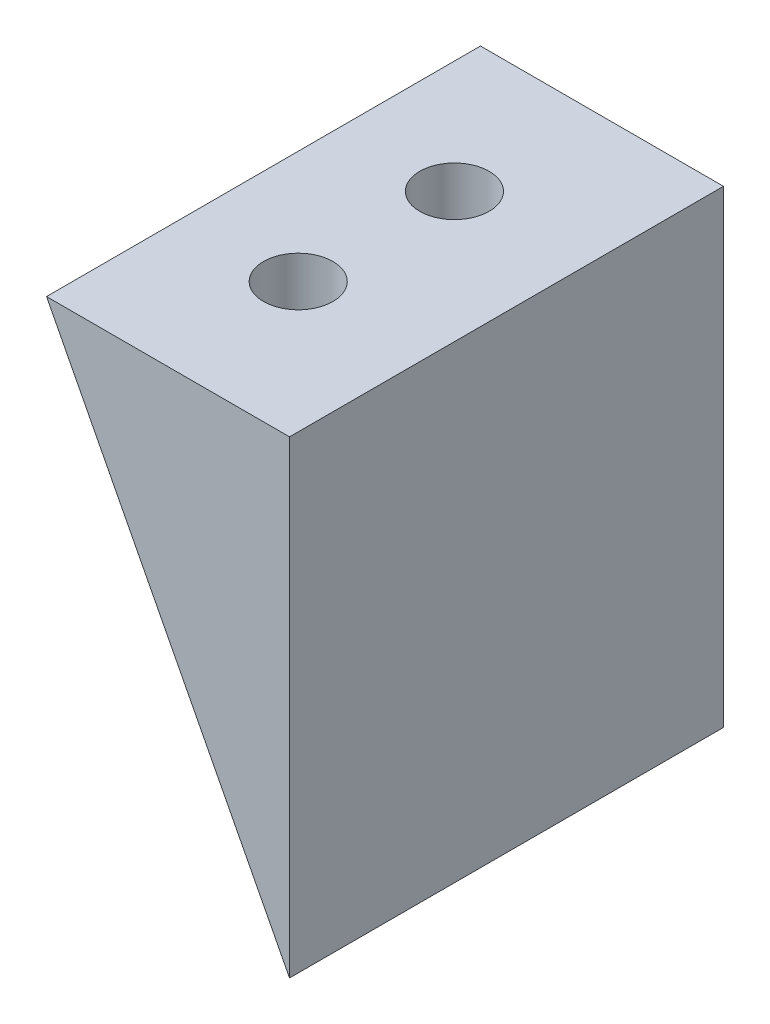
ISO-10303-21;
HEADER;
FILE_DESCRIPTION(('STEP AP214'),'2;1');
FILE_NAME('part.step','',(''),(''),'','','');
FILE_SCHEMA(('AUTOMOTIVE_DESIGN { 1 0 10303 214 1 1 1 1 }'));
ENDSEC;
DATA;
#1=APPLICATION_CONTEXT('core data for automotive mechanical design processes');
#2=APPLICATION_PROTOCOL_DEFINITION('international standard','automotive_design',2000,#1);
#3=PRODUCT_CONTEXT('',#1,'mechanical');
#4=PRODUCT('Part','Part','',(#3));
#5=PRODUCT_RELATED_PRODUCT_CATEGORY('part','',(#4));
#6=PRODUCT_DEFINITION_FORMATION('','',#4);
#7=PRODUCT_DEFINITION_CONTEXT('part definition',#1,'design');
#8=PRODUCT_DEFINITION('design','',#6,#7);
#9=PRODUCT_DEFINITION_SHAPE('','',#8);
#10=(LENGTH_UNIT() NAMED_UNIT(*) SI_UNIT(.MILLI.,.METRE.));
#11=(NAMED_UNIT(*) PLANE_ANGLE_UNIT() SI_UNIT($,.RADIAN.));
#12=(NAMED_UNIT(*) SI_UNIT($,.STERADIAN.) SOLID_ANGLE_UNIT());
#13=UNCERTAINTY_MEASURE_WITH_UNIT(LENGTH_MEASURE(1.E-05),#10,'distance_accuracy_value','');
#14=(GEOMETRIC_REPRESENTATION_CONTEXT(3) GLOBAL_UNCERTAINTY_ASSIGNED_CONTEXT((#13)) GLOBAL_UNIT_ASSIGNED_CONTEXT((#10,
#11,#12)) REPRESENTATION_CONTEXT('',''));
#15=CARTESIAN_POINT('',(0.,0.,0.));
#16=DIRECTION('',(0.,0.,1.));
#17=DIRECTION('',(1.,0.,0.));
#18=AXIS2_PLACEMENT_3D('',#15,#16,#17);
#19=CARTESIAN_POINT('',(0.,27.,25.));
#20=DIRECTION('',(-1.,0.,0.));
#21=DIRECTION('',(0.,-1.,0.));
#22=AXIS2_PLACEMENT_3D('',#19,#20,#21);
#23=PLANE('',#22);
#24=DIRECTION('',(0.,1.,0.));
#25=VECTOR('',#24,1.);
#26=CARTESIAN_POINT('',(0.,27.,0.));
#27=LINE('',#26,#25);
#28=CARTESIAN_POINT('',(0.,0.,0.));
#29=VERTEX_POINT('',#28);
#30=CARTESIAN_POINT('',(0.,27.,0.));
#31=VERTEX_POINT('',#30);
#32=EDGE_CURVE('E82',#29,#31,#27,.T.);
#33=ORIENTED_EDGE('',*,*,#32,.T.);
#34=DIRECTION('',(0.,0.,-1.));
#35=VECTOR('',#34,1.);
#36=CARTESIAN_POINT('',(0.,27.,25.));
#37=LINE('',#36,#35);
#38=CARTESIAN_POINT('',(0.,27.,25.));
#39=VERTEX_POINT('',#38);
#40=EDGE_CURVE('E11',#39,#31,#37,.T.);
#41=ORIENTED_EDGE('',*,*,#40,.F.);
#42=DIRECTION('',(0.,1.,0.));
#43=VECTOR('',#42,1.);
#44=CARTESIAN_POINT('',(0.,27.,25.));
#45=LINE('',#44,#43);
#46=CARTESIAN_POINT('',(0.,0.,25.));
#47=VERTEX_POINT('',#46);
#48=EDGE_CURVE('E75',#47,#39,#45,.T.);
#49=ORIENTED_EDGE('',*,*,#48,.F.);
#50=DIRECTION('',(0.,0.,-1.));
#51=VECTOR('',#50,1.);
#52=CARTESIAN_POINT('',(0.,0.,25.));
#53=LINE('',#52,#51);
#54=EDGE_CURVE('E83',#47,#29,#53,.T.);
#55=ORIENTED_EDGE('',*,*,#54,.T.);
#56=EDGE_LOOP('',(#33,#41,#49,#55));
#57=FACE_BOUND('',#56,.T.);
#58=ADVANCED_FACE('F35',(#57),#23,.F.);
#59=CARTESIAN_POINT('',(-14.,27.,25.));
#60=DIRECTION('',(0.,-1.,0.));
#61=DIRECTION('',(0.,0.,-1.));
#62=AXIS2_PLACEMENT_3D('',#59,#60,#61);
#63=PLANE('',#62);
#64=CARTESIAN_POINT('',(-7.5,27.,17.));
#65=DIRECTION('',(0.,1.,0.));
#66=DIRECTION('',(0.,0.,1.));
#67=AXIS2_PLACEMENT_3D('',#64,#65,#66);
#68=CIRCLE('',#67,2.);
#69=CARTESIAN_POINT('',(-7.5,27.,19.));
#70=VERTEX_POINT('',#69);
#71=EDGE_CURVE('E119',#70,#70,#68,.T.);
#72=ORIENTED_EDGE('',*,*,#71,.F.);
#73=EDGE_LOOP('',(#72));
#74=FACE_BOUND('',#73,.T.);
#75=CARTESIAN_POINT('',(-7.5,27.,8.));
#76=DIRECTION('',(0.,1.,0.));
#77=DIRECTION('',(0.,0.,1.));
#78=AXIS2_PLACEMENT_3D('',#75,#76,#77);
#79=CIRCLE('',#78,2.);
#80=CARTESIAN_POINT('',(-7.5,27.,10.));
#81=VERTEX_POINT('',#80);
#82=EDGE_CURVE('E89',#81,#81,#79,.T.);
#83=ORIENTED_EDGE('',*,*,#82,.F.);
#84=EDGE_LOOP('',(#83));
#85=FACE_BOUND('',#84,.T.);
#86=DIRECTION('',(-1.,0.,0.));
#87=VECTOR('',#86,1.);
#88=CARTESIAN_POINT('',(-14.,27.,0.));
#89=LINE('',#88,#87);
#90=CARTESIAN_POINT('',(-14.,27.,0.));
#91=VERTEX_POINT('',#90);
#92=EDGE_CURVE('E63',#31,#91,#89,.T.);
#93=ORIENTED_EDGE('',*,*,#92,.T.);
#94=DIRECTION('',(0.,0.,-1.));
#95=VECTOR('',#94,1.);
#96=CARTESIAN_POINT('',(-14.,27.,25.));
#97=LINE('',#96,#95);
#98=CARTESIAN_POINT('',(-14.,27.,25.));
#99=VERTEX_POINT('',#98);
#100=EDGE_CURVE('E43',#99,#91,#97,.T.);
#101=ORIENTED_EDGE('',*,*,#100,.F.);
#102=DIRECTION('',(-1.,0.,0.));
#103=VECTOR('',#102,1.);
#104=CARTESIAN_POINT('',(-14.,27.,25.));
#105=LINE('',#104,#103);
#106=EDGE_CURVE('E71',#39,#99,#105,.T.);
#107=ORIENTED_EDGE('',*,*,#106,.F.);
#108=ORIENTED_EDGE('',*,*,#40,.T.);
#109=EDGE_LOOP('',(#93,#101,#107,#108));
#110=FACE_BOUND('',#109,.T.);
#111=ADVANCED_FACE('F72',(#74,#85,#110),#63,.F.);
#112=CARTESIAN_POINT('',(0.,0.,25.));
#113=DIRECTION('',(0.887754531448929,0.460317164455,0.));
#114=DIRECTION('',(-0.460317164455,0.887754531448929,0.));
#115=AXIS2_PLACEMENT_3D('',#112,#113,#114);
#116=PLANE('',#115);
#117=DIRECTION('',(0.460317164455,-0.887754531448929,0.));
#118=VECTOR('',#117,1.);
#119=CARTESIAN_POINT('',(0.,0.,0.));
#120=LINE('',#119,#118);
#121=EDGE_CURVE('E68',#91,#29,#120,.T.);
#122=ORIENTED_EDGE('',*,*,#121,.T.);
#123=ORIENTED_EDGE('',*,*,#54,.F.);
#124=DIRECTION('',(0.460317164455,-0.887754531448929,0.));
#125=VECTOR('',#124,1.);
#126=CARTESIAN_POINT('',(0.,0.,25.));
#127=LINE('',#126,#125);
#128=EDGE_CURVE('E51',#99,#47,#127,.T.);
#129=ORIENTED_EDGE('',*,*,#128,.F.);
#130=ORIENTED_EDGE('',*,*,#100,.T.);
#131=EDGE_LOOP('',(#122,#123,#129,#130));
#132=FACE_BOUND('',#131,.T.);
#133=ADVANCED_FACE('F94',(#132),#116,.F.);
#134=CARTESIAN_POINT('',(0.,0.,25.));
#135=DIRECTION('',(0.,0.,1.));
#136=DIRECTION('',(1.,0.,0.));
#137=AXIS2_PLACEMENT_3D('',#134,#135,#136);
#138=PLANE('',#137);
#139=ORIENTED_EDGE('',*,*,#48,.T.);
#140=ORIENTED_EDGE('',*,*,#106,.T.);
#141=ORIENTED_EDGE('',*,*,#128,.T.);
#142=EDGE_LOOP('',(#139,#140,#141));
#143=FACE_BOUND('',#142,.T.);
#144=ADVANCED_FACE('F78',(#143),#138,.T.);
#145=CARTESIAN_POINT('',(0.,0.,0.));
#146=DIRECTION('',(0.,0.,1.));
#147=DIRECTION('',(1.,0.,0.));
#148=AXIS2_PLACEMENT_3D('',#145,#146,#147);
#149=PLANE('',#148);
#150=ORIENTED_EDGE('',*,*,#32,.F.);
#151=ORIENTED_EDGE('',*,*,#121,.F.);
#152=ORIENTED_EDGE('',*,*,#92,.F.);
#153=EDGE_LOOP('',(#150,#151,#152));
#154=FACE_BOUND('',#153,.T.);
#155=ADVANCED_FACE('F95',(#154),#149,.F.);
#156=CARTESIAN_POINT('',(-7.5,22.,8.));
#157=DIRECTION('',(0.,1.,0.));
#158=DIRECTION('',(0.,0.,1.));
#159=AXIS2_PLACEMENT_3D('',#156,#157,#158);
#160=CYLINDRICAL_SURFACE('',#159,2.);
#161=CARTESIAN_POINT('',(-7.5,22.,8.));
#162=DIRECTION('',(0.,1.,0.));
#163=DIRECTION('',(0.,0.,1.));
#164=AXIS2_PLACEMENT_3D('',#161,#162,#163);
#165=CIRCLE('',#164,2.);
#166=CARTESIAN_POINT('',(-7.5,22.,10.));
#167=VERTEX_POINT('',#166);
#168=EDGE_CURVE('E85',#167,#167,#165,.T.);
#169=ORIENTED_EDGE('',*,*,#168,.F.);
#170=EDGE_LOOP('',(#169));
#171=FACE_BOUND('',#170,.T.);
#172=ORIENTED_EDGE('',*,*,#82,.T.);
#173=EDGE_LOOP('',(#172));
#174=FACE_BOUND('',#173,.T.);
#175=ADVANCED_FACE('F97',(#171,#174),#160,.F.);
#176=CARTESIAN_POINT('',(-7.5,22.,8.));
#177=DIRECTION('',(0.,1.,0.));
#178=DIRECTION('',(0.,0.,1.));
#179=AXIS2_PLACEMENT_3D('',#176,#177,#178);
#180=PLANE('',#179);
#181=ORIENTED_EDGE('',*,*,#168,.T.);
#182=EDGE_LOOP('',(#181));
#183=FACE_BOUND('',#182,.T.);
#184=ADVANCED_FACE('F103',(#183),#180,.T.);
#185=CARTESIAN_POINT('',(-7.5,22.,17.));
#186=DIRECTION('',(0.,1.,0.));
#187=DIRECTION('',(0.,0.,1.));
#188=AXIS2_PLACEMENT_3D('',#185,#186,#187);
#189=CYLINDRICAL_SURFACE('',#188,2.);
#190=CARTESIAN_POINT('',(-7.5,22.,17.));
#191=DIRECTION('',(0.,1.,0.));
#192=DIRECTION('',(0.,0.,1.));
#193=AXIS2_PLACEMENT_3D('',#190,#191,#192);
#194=CIRCLE('',#193,2.);
#195=CARTESIAN_POINT('',(-7.5,22.,19.));
#196=VERTEX_POINT('',#195);
#197=EDGE_CURVE('E123',#196,#196,#194,.T.);
#198=ORIENTED_EDGE('',*,*,#197,.F.);
#199=EDGE_LOOP('',(#198));
#200=FACE_BOUND('',#199,.T.);
#201=ORIENTED_EDGE('',*,*,#71,.T.);
#202=EDGE_LOOP('',(#201));
#203=FACE_BOUND('',#202,.T.);
#204=ADVANCED_FACE('F129',(#200,#203),#189,.F.);
#205=CARTESIAN_POINT('',(-7.5,22.,17.));
#206=DIRECTION('',(0.,1.,0.));
#207=DIRECTION('',(0.,0.,1.));
#208=AXIS2_PLACEMENT_3D('',#205,#206,#207);
#209=PLANE('',#208);
#210=ORIENTED_EDGE('',*,*,#197,.T.);
#211=EDGE_LOOP('',(#210));
#212=FACE_BOUND('',#211,.T.);
#213=ADVANCED_FACE('F131',(#212),#209,.T.);
#214=CLOSED_SHELL('',(#58,#111,#133,#144,#155,#175,#184,#204,#213));
#215=MANIFOLD_SOLID_BREP('B2',#214);
#216=ADVANCED_BREP_SHAPE_REPRESENTATION('',(#18,#215),#14);
#217=SHAPE_DEFINITION_REPRESENTATION(#9,#216);
ENDSEC;
END-ISO-10303-21;
